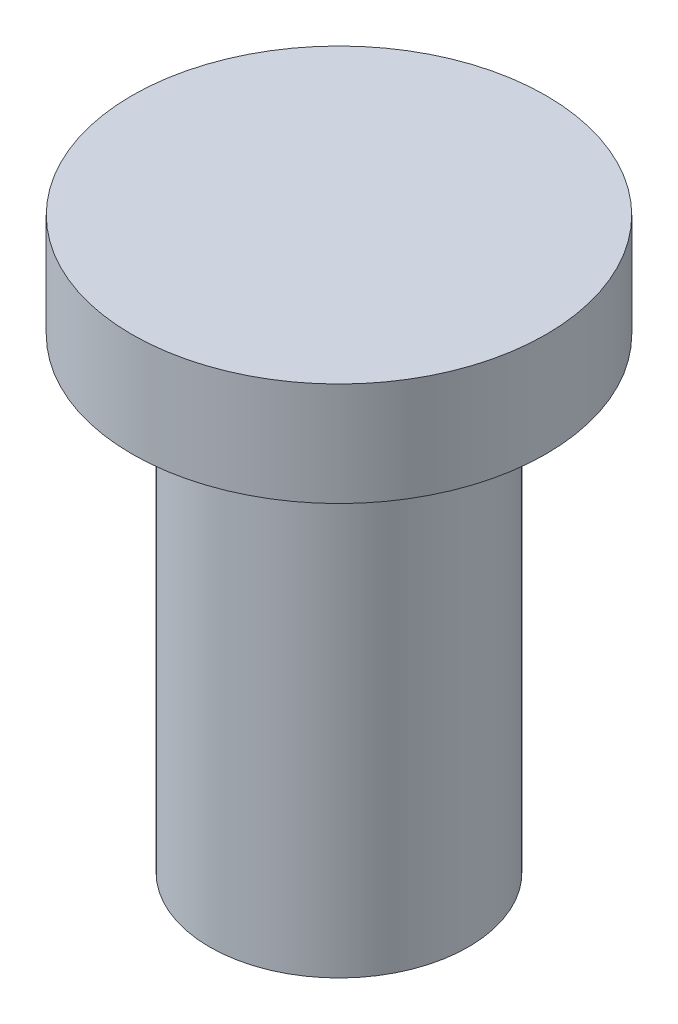
ISO-10303-21;
HEADER;
FILE_DESCRIPTION(('STEP AP214'),'2;1');
FILE_NAME('part.step','',(''),(''),'','','');
FILE_SCHEMA(('AUTOMOTIVE_DESIGN { 1 0 10303 214 1 1 1 1 }'));
ENDSEC;
DATA;
#1=APPLICATION_CONTEXT('core data for automotive mechanical design processes');
#2=APPLICATION_PROTOCOL_DEFINITION('international standard','automotive_design',2000,#1);
#3=PRODUCT_CONTEXT('',#1,'mechanical');
#4=PRODUCT('Part','Part','',(#3));
#5=PRODUCT_RELATED_PRODUCT_CATEGORY('part','',(#4));
#6=PRODUCT_DEFINITION_FORMATION('','',#4);
#7=PRODUCT_DEFINITION_CONTEXT('part definition',#1,'design');
#8=PRODUCT_DEFINITION('design','',#6,#7);
#9=PRODUCT_DEFINITION_SHAPE('','',#8);
#10=(LENGTH_UNIT() NAMED_UNIT(*) SI_UNIT(.MILLI.,.METRE.));
#11=(NAMED_UNIT(*) PLANE_ANGLE_UNIT() SI_UNIT($,.RADIAN.));
#12=(NAMED_UNIT(*) SI_UNIT($,.STERADIAN.) SOLID_ANGLE_UNIT());
#13=UNCERTAINTY_MEASURE_WITH_UNIT(LENGTH_MEASURE(1.E-05),#10,'distance_accuracy_value','');
#14=(GEOMETRIC_REPRESENTATION_CONTEXT(3) GLOBAL_UNCERTAINTY_ASSIGNED_CONTEXT((#13)) GLOBAL_UNIT_ASSIGNED_CONTEXT((#10,
#11,#12)) REPRESENTATION_CONTEXT('',''));
#15=CARTESIAN_POINT('',(0.,0.,0.));
#16=DIRECTION('',(0.,0.,1.));
#17=DIRECTION('',(1.,0.,0.));
#18=AXIS2_PLACEMENT_3D('',#15,#16,#17);
#19=CARTESIAN_POINT('',(0.,4.5,0.));
#20=DIRECTION('',(0.,-1.,0.));
#21=DIRECTION('',(0.,0.,-1.));
#22=AXIS2_PLACEMENT_3D('',#19,#20,#21);
#23=CYLINDRICAL_SURFACE('',#22,1.25);
#24=CARTESIAN_POINT('',(0.,4.5,0.));
#25=DIRECTION('',(0.,1.,0.));
#26=DIRECTION('',(0.,0.,1.));
#27=AXIS2_PLACEMENT_3D('',#24,#25,#26);
#28=CIRCLE('',#27,1.25);
#29=CARTESIAN_POINT('',(0.,4.5,1.25));
#30=VERTEX_POINT('',#29);
#31=EDGE_CURVE('E10',#30,#30,#28,.T.);
#32=ORIENTED_EDGE('',*,*,#31,.F.);
#33=EDGE_LOOP('',(#32));
#34=FACE_BOUND('',#33,.T.);
#35=CARTESIAN_POINT('',(0.,0.,0.));
#36=DIRECTION('',(0.,1.,0.));
#37=DIRECTION('',(0.,0.,1.));
#38=AXIS2_PLACEMENT_3D('',#35,#36,#37);
#39=CIRCLE('',#38,1.25);
#40=CARTESIAN_POINT('',(0.,0.,1.25));
#41=VERTEX_POINT('',#40);
#42=EDGE_CURVE('E34',#41,#41,#39,.T.);
#43=ORIENTED_EDGE('',*,*,#42,.T.);
#44=EDGE_LOOP('',(#43));
#45=FACE_BOUND('',#44,.T.);
#46=ADVANCED_FACE('F31',(#34,#45),#23,.T.);
#47=CARTESIAN_POINT('',(0.,0.,0.));
#48=DIRECTION('',(0.,1.,0.));
#49=DIRECTION('',(0.,0.,1.));
#50=AXIS2_PLACEMENT_3D('',#47,#48,#49);
#51=PLANE('',#50);
#52=ORIENTED_EDGE('',*,*,#42,.F.);
#53=EDGE_LOOP('',(#52));
#54=FACE_BOUND('',#53,.T.);
#55=ADVANCED_FACE('F54',(#54),#51,.F.);
#56=CARTESIAN_POINT('',(0.,5.5,0.));
#57=DIRECTION('',(0.,-1.,0.));
#58=DIRECTION('',(0.,0.,-1.));
#59=AXIS2_PLACEMENT_3D('',#56,#57,#58);
#60=CYLINDRICAL_SURFACE('',#59,2.);
#61=CARTESIAN_POINT('',(0.,5.5,0.));
#62=DIRECTION('',(0.,1.,0.));
#63=DIRECTION('',(0.,0.,1.));
#64=AXIS2_PLACEMENT_3D('',#61,#62,#63);
#65=CIRCLE('',#64,2.);
#66=CARTESIAN_POINT('',(0.,5.5,2.));
#67=VERTEX_POINT('',#66);
#68=EDGE_CURVE('E41',#67,#67,#65,.T.);
#69=ORIENTED_EDGE('',*,*,#68,.F.);
#70=EDGE_LOOP('',(#69));
#71=FACE_BOUND('',#70,.T.);
#72=CARTESIAN_POINT('',(0.,4.5,0.));
#73=DIRECTION('',(0.,1.,0.));
#74=DIRECTION('',(0.,0.,1.));
#75=AXIS2_PLACEMENT_3D('',#72,#73,#74);
#76=CIRCLE('',#75,2.);
#77=CARTESIAN_POINT('',(0.,4.5,2.));
#78=VERTEX_POINT('',#77);
#79=EDGE_CURVE('E43',#78,#78,#76,.T.);
#80=ORIENTED_EDGE('',*,*,#79,.T.);
#81=EDGE_LOOP('',(#80));
#82=FACE_BOUND('',#81,.T.);
#83=ADVANCED_FACE('F51',(#71,#82),#60,.T.);
#84=CARTESIAN_POINT('',(0.,5.5,0.));
#85=DIRECTION('',(0.,1.,0.));
#86=DIRECTION('',(0.,0.,1.));
#87=AXIS2_PLACEMENT_3D('',#84,#85,#86);
#88=PLANE('',#87);
#89=ORIENTED_EDGE('',*,*,#68,.T.);
#90=EDGE_LOOP('',(#89));
#91=FACE_BOUND('',#90,.T.);
#92=ADVANCED_FACE('F49',(#91),#88,.T.);
#93=CARTESIAN_POINT('',(0.,4.5,0.));
#94=DIRECTION('',(0.,1.,0.));
#95=DIRECTION('',(0.,0.,1.));
#96=AXIS2_PLACEMENT_3D('',#93,#94,#95);
#97=PLANE('',#96);
#98=ORIENTED_EDGE('',*,*,#31,.T.);
#99=EDGE_LOOP('',(#98));
#100=FACE_BOUND('',#99,.T.);
#101=ORIENTED_EDGE('',*,*,#79,.F.);
#102=EDGE_LOOP('',(#101));
#103=FACE_BOUND('',#102,.T.);
#104=ADVANCED_FACE('F58',(#100,#103),#97,.F.);
#105=CLOSED_SHELL('',(#46,#55,#83,#92,#104));
#106=MANIFOLD_SOLID_BREP('B2',#105);
#107=ADVANCED_BREP_SHAPE_REPRESENTATION('',(#18,#106),#14);
#108=SHAPE_DEFINITION_REPRESENTATION(#9,#107);
ENDSEC;
END-ISO-10303-21;
